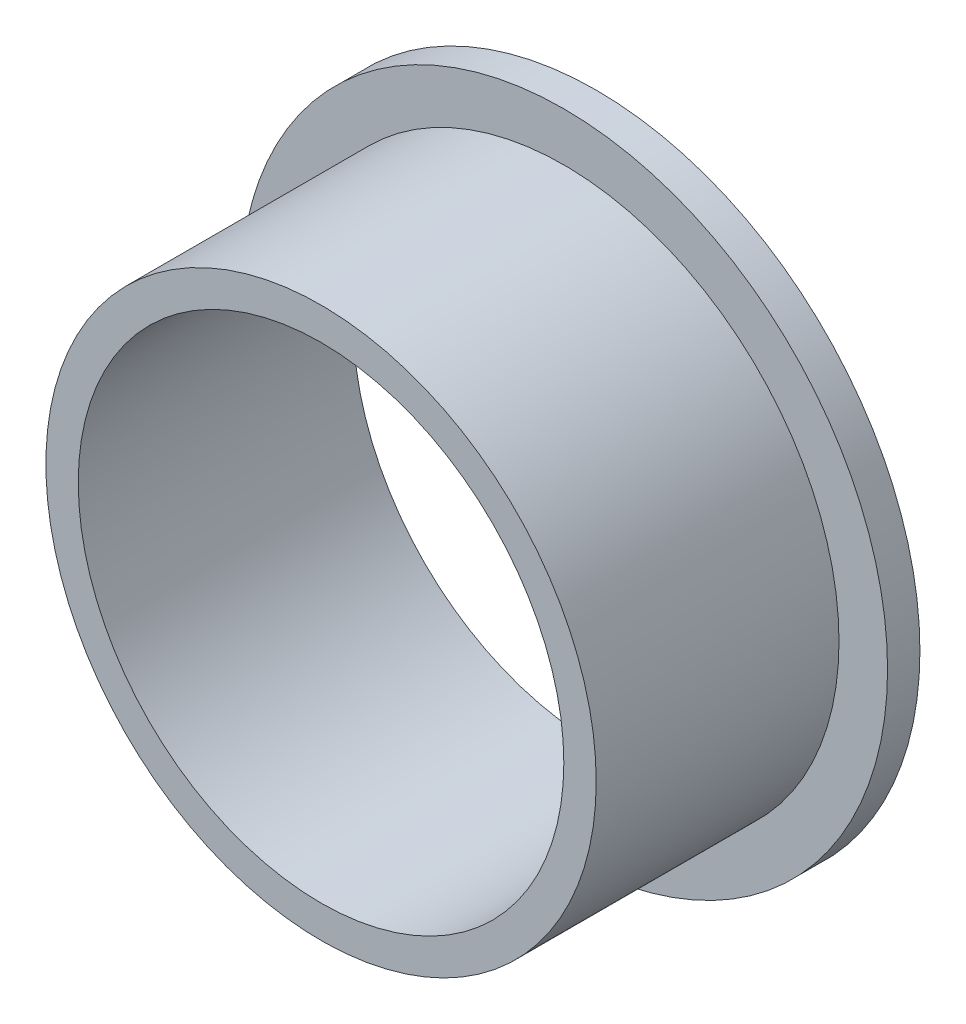
ISO-10303-21;
HEADER;
FILE_DESCRIPTION(('STEP AP214'),'2;1');
FILE_NAME('part.step','',(''),(''),'','','');
FILE_SCHEMA(('AUTOMOTIVE_DESIGN { 1 0 10303 214 1 1 1 1 }'));
ENDSEC;
DATA;
#1=APPLICATION_CONTEXT('core data for automotive mechanical design processes');
#2=APPLICATION_PROTOCOL_DEFINITION('international standard','automotive_design',2000,#1);
#3=PRODUCT_CONTEXT('',#1,'mechanical');
#4=PRODUCT('Part','Part','',(#3));
#5=PRODUCT_RELATED_PRODUCT_CATEGORY('part','',(#4));
#6=PRODUCT_DEFINITION_FORMATION('','',#4);
#7=PRODUCT_DEFINITION_CONTEXT('part definition',#1,'design');
#8=PRODUCT_DEFINITION('design','',#6,#7);
#9=PRODUCT_DEFINITION_SHAPE('','',#8);
#10=(LENGTH_UNIT() NAMED_UNIT(*) SI_UNIT(.MILLI.,.METRE.));
#11=(NAMED_UNIT(*) PLANE_ANGLE_UNIT() SI_UNIT($,.RADIAN.));
#12=(NAMED_UNIT(*) SI_UNIT($,.STERADIAN.) SOLID_ANGLE_UNIT());
#13=UNCERTAINTY_MEASURE_WITH_UNIT(LENGTH_MEASURE(1.E-05),#10,'distance_accuracy_value','');
#14=(GEOMETRIC_REPRESENTATION_CONTEXT(3) GLOBAL_UNCERTAINTY_ASSIGNED_CONTEXT((#13)) GLOBAL_UNIT_ASSIGNED_CONTEXT((#10,
#11,#12)) REPRESENTATION_CONTEXT('',''));
#15=CARTESIAN_POINT('',(0.,0.,0.));
#16=DIRECTION('',(0.,0.,1.));
#17=DIRECTION('',(1.,0.,0.));
#18=AXIS2_PLACEMENT_3D('',#15,#16,#17);
#19=CARTESIAN_POINT('',(0.,0.,-2.));
#20=DIRECTION('',(0.,0.,1.));
#21=DIRECTION('',(1.,0.,0.));
#22=AXIS2_PLACEMENT_3D('',#19,#20,#21);
#23=CYLINDRICAL_SURFACE('',#22,15.);
#24=CARTESIAN_POINT('',(0.,0.,-2.));
#25=DIRECTION('',(0.,0.,1.));
#26=DIRECTION('',(1.,0.,0.));
#27=AXIS2_PLACEMENT_3D('',#24,#25,#26);
#28=CIRCLE('',#27,15.);
#29=CARTESIAN_POINT('',(15.,0.,-2.));
#30=VERTEX_POINT('',#29);
#31=EDGE_CURVE('E47',#30,#30,#28,.T.);
#32=ORIENTED_EDGE('',*,*,#31,.F.);
#33=EDGE_LOOP('',(#32));
#34=FACE_BOUND('',#33,.T.);
#35=CARTESIAN_POINT('',(0.,0.,15.));
#36=DIRECTION('',(0.,0.,1.));
#37=DIRECTION('',(1.,0.,0.));
#38=AXIS2_PLACEMENT_3D('',#35,#36,#37);
#39=CIRCLE('',#38,15.);
#40=CARTESIAN_POINT('',(15.,0.,15.));
#41=VERTEX_POINT('',#40);
#42=EDGE_CURVE('E42',#41,#41,#39,.F.);
#43=ORIENTED_EDGE('',*,*,#42,.F.);
#44=EDGE_LOOP('',(#43));
#45=FACE_BOUND('',#44,.T.);
#46=ADVANCED_FACE('F15',(#34,#45),#23,.F.);
#47=CARTESIAN_POINT('',(20.,-20.,-2.));
#48=DIRECTION('',(0.,0.,-1.));
#49=DIRECTION('',(-1.,0.,0.));
#50=AXIS2_PLACEMENT_3D('',#47,#48,#49);
#51=PLANE('',#50);
#52=ORIENTED_EDGE('',*,*,#31,.T.);
#53=EDGE_LOOP('',(#52));
#54=FACE_BOUND('',#53,.T.);
#55=CARTESIAN_POINT('',(0.,0.,-2.));
#56=DIRECTION('',(0.,0.,1.));
#57=DIRECTION('',(1.,0.,0.));
#58=AXIS2_PLACEMENT_3D('',#55,#56,#57);
#59=CIRCLE('',#58,20.);
#60=CARTESIAN_POINT('',(20.,0.,-2.));
#61=VERTEX_POINT('',#60);
#62=EDGE_CURVE('E37',#61,#61,#59,.F.);
#63=ORIENTED_EDGE('',*,*,#62,.T.);
#64=EDGE_LOOP('',(#63));
#65=FACE_BOUND('',#64,.T.);
#66=ADVANCED_FACE('F52',(#54,#65),#51,.T.);
#67=CARTESIAN_POINT('',(-17.,-17.,15.));
#68=DIRECTION('',(0.,0.,1.));
#69=DIRECTION('',(1.,0.,0.));
#70=AXIS2_PLACEMENT_3D('',#67,#68,#69);
#71=PLANE('',#70);
#72=ORIENTED_EDGE('',*,*,#42,.T.);
#73=EDGE_LOOP('',(#72));
#74=FACE_BOUND('',#73,.T.);
#75=CARTESIAN_POINT('',(0.,0.,15.));
#76=DIRECTION('',(0.,0.,1.));
#77=DIRECTION('',(1.,0.,0.));
#78=AXIS2_PLACEMENT_3D('',#75,#76,#77);
#79=CIRCLE('',#78,17.);
#80=CARTESIAN_POINT('',(17.,0.,15.));
#81=VERTEX_POINT('',#80);
#82=EDGE_CURVE('E28',#81,#81,#79,.T.);
#83=ORIENTED_EDGE('',*,*,#82,.T.);
#84=EDGE_LOOP('',(#83));
#85=FACE_BOUND('',#84,.T.);
#86=ADVANCED_FACE('F60',(#74,#85),#71,.T.);
#87=CARTESIAN_POINT('',(0.,0.,-2.));
#88=DIRECTION('',(0.,0.,1.));
#89=DIRECTION('',(1.,0.,0.));
#90=AXIS2_PLACEMENT_3D('',#87,#88,#89);
#91=CYLINDRICAL_SURFACE('',#90,20.);
#92=ORIENTED_EDGE('',*,*,#62,.F.);
#93=EDGE_LOOP('',(#92));
#94=FACE_BOUND('',#93,.T.);
#95=CARTESIAN_POINT('',(0.,0.,0.));
#96=DIRECTION('',(0.,0.,1.));
#97=DIRECTION('',(1.,0.,0.));
#98=AXIS2_PLACEMENT_3D('',#95,#96,#97);
#99=CIRCLE('',#98,20.);
#100=CARTESIAN_POINT('',(20.,0.,0.));
#101=VERTEX_POINT('',#100);
#102=EDGE_CURVE('E23',#101,#101,#99,.T.);
#103=ORIENTED_EDGE('',*,*,#102,.F.);
#104=EDGE_LOOP('',(#103));
#105=FACE_BOUND('',#104,.T.);
#106=ADVANCED_FACE('F63',(#94,#105),#91,.T.);
#107=CARTESIAN_POINT('',(0.,0.,0.));
#108=DIRECTION('',(0.,0.,1.));
#109=DIRECTION('',(1.,0.,0.));
#110=AXIS2_PLACEMENT_3D('',#107,#108,#109);
#111=CYLINDRICAL_SURFACE('',#110,17.);
#112=CARTESIAN_POINT('',(0.,0.,0.));
#113=DIRECTION('',(0.,0.,1.));
#114=DIRECTION('',(1.,0.,0.));
#115=AXIS2_PLACEMENT_3D('',#112,#113,#114);
#116=CIRCLE('',#115,17.);
#117=CARTESIAN_POINT('',(17.,0.,0.));
#118=VERTEX_POINT('',#117);
#119=EDGE_CURVE('E10',#118,#118,#116,.F.);
#120=ORIENTED_EDGE('',*,*,#119,.F.);
#121=EDGE_LOOP('',(#120));
#122=FACE_BOUND('',#121,.T.);
#123=ORIENTED_EDGE('',*,*,#82,.F.);
#124=EDGE_LOOP('',(#123));
#125=FACE_BOUND('',#124,.T.);
#126=ADVANCED_FACE('F66',(#122,#125),#111,.T.);
#127=CARTESIAN_POINT('',(-20.,-20.,0.));
#128=DIRECTION('',(0.,0.,1.));
#129=DIRECTION('',(1.,0.,0.));
#130=AXIS2_PLACEMENT_3D('',#127,#128,#129);
#131=PLANE('',#130);
#132=ORIENTED_EDGE('',*,*,#119,.T.);
#133=EDGE_LOOP('',(#132));
#134=FACE_BOUND('',#133,.T.);
#135=ORIENTED_EDGE('',*,*,#102,.T.);
#136=EDGE_LOOP('',(#135));
#137=FACE_BOUND('',#136,.T.);
#138=ADVANCED_FACE('F17',(#134,#137),#131,.T.);
#139=CLOSED_SHELL('',(#46,#66,#86,#106,#126,#138));
#140=MANIFOLD_SOLID_BREP('B1',#139);
#141=ADVANCED_BREP_SHAPE_REPRESENTATION('',(#18,#140),#14);
#142=SHAPE_DEFINITION_REPRESENTATION(#9,#141);
ENDSEC;
END-ISO-10303-21;
